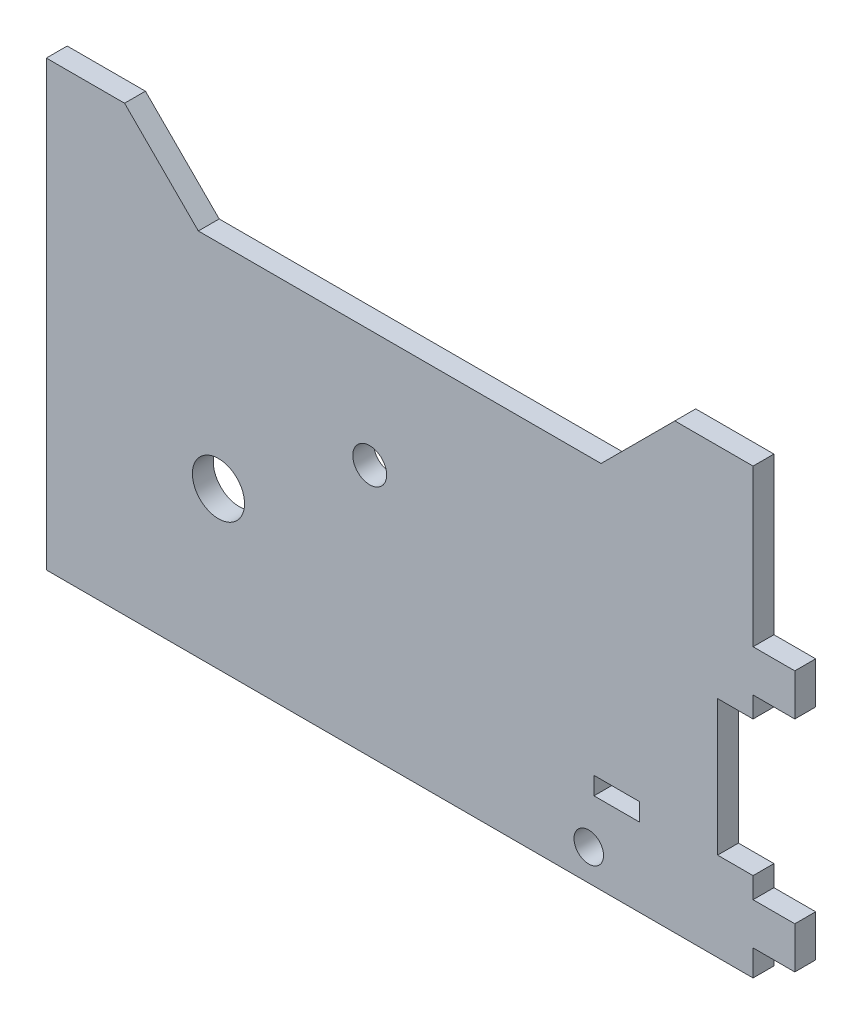
ISO-10303-21;
HEADER;
FILE_DESCRIPTION(('STEP AP214'),'2;1');
FILE_NAME('part.step','',(''),(''),'','','');
FILE_SCHEMA(('AUTOMOTIVE_DESIGN { 1 0 10303 214 1 1 1 1 }'));
ENDSEC;
DATA;
#1=APPLICATION_CONTEXT('core data for automotive mechanical design processes');
#2=APPLICATION_PROTOCOL_DEFINITION('international standard','automotive_design',2000,#1);
#3=PRODUCT_CONTEXT('',#1,'mechanical');
#4=PRODUCT('Part','Part','',(#3));
#5=PRODUCT_RELATED_PRODUCT_CATEGORY('part','',(#4));
#6=PRODUCT_DEFINITION_FORMATION('','',#4);
#7=PRODUCT_DEFINITION_CONTEXT('part definition',#1,'design');
#8=PRODUCT_DEFINITION('design','',#6,#7);
#9=PRODUCT_DEFINITION_SHAPE('','',#8);
#10=(LENGTH_UNIT() NAMED_UNIT(*) SI_UNIT(.MILLI.,.METRE.));
#11=(NAMED_UNIT(*) PLANE_ANGLE_UNIT() SI_UNIT($,.RADIAN.));
#12=(NAMED_UNIT(*) SI_UNIT($,.STERADIAN.) SOLID_ANGLE_UNIT());
#13=UNCERTAINTY_MEASURE_WITH_UNIT(LENGTH_MEASURE(1.E-05),#10,'distance_accuracy_value','');
#14=(GEOMETRIC_REPRESENTATION_CONTEXT(3) GLOBAL_UNCERTAINTY_ASSIGNED_CONTEXT((#13)) GLOBAL_UNIT_ASSIGNED_CONTEXT((#10,
#11,#12)) REPRESENTATION_CONTEXT('',''));
#15=CARTESIAN_POINT('',(0.,0.,0.));
#16=DIRECTION('',(0.,0.,1.));
#17=DIRECTION('',(1.,0.,0.));
#18=AXIS2_PLACEMENT_3D('',#15,#16,#17);
#19=CARTESIAN_POINT('',(0.,0.,4.));
#20=DIRECTION('',(0.,0.,-1.));
#21=DIRECTION('',(-1.,0.,0.));
#22=AXIS2_PLACEMENT_3D('',#19,#20,#21);
#23=PLANE('',#22);
#24=CARTESIAN_POINT('',(-46.,0.,4.));
#25=DIRECTION('',(0.,0.,1.));
#26=DIRECTION('',(1.,0.,0.));
#27=AXIS2_PLACEMENT_3D('',#24,#25,#26);
#28=CIRCLE('',#27,5.);
#29=CARTESIAN_POINT('',(-41.,0.,4.));
#30=VERTEX_POINT('',#29);
#31=EDGE_CURVE('E287',#30,#30,#28,.T.);
#32=ORIENTED_EDGE('',*,*,#31,.F.);
#33=EDGE_LOOP('',(#32));
#34=FACE_BOUND('',#33,.T.);
#35=CARTESIAN_POINT('',(-17.,18.39610675,4.));
#36=DIRECTION('',(0.,0.,1.));
#37=DIRECTION('',(1.,0.,0.));
#38=AXIS2_PLACEMENT_3D('',#35,#36,#37);
#39=CIRCLE('',#38,3.25);
#40=CARTESIAN_POINT('',(-13.75,18.39610675,4.));
#41=VERTEX_POINT('',#40);
#42=EDGE_CURVE('E293',#41,#41,#39,.T.);
#43=ORIENTED_EDGE('',*,*,#42,.F.);
#44=EDGE_LOOP('',(#43));
#45=FACE_BOUND('',#44,.T.);
#46=DIRECTION('',(0.,1.,0.));
#47=VECTOR('',#46,1.);
#48=CARTESIAN_POINT('',(56.5,30.,4.));
#49=LINE('',#48,#47);
#50=CARTESIAN_POINT('',(56.5,25.,4.));
#51=VERTEX_POINT('',#50);
#52=CARTESIAN_POINT('',(56.5,55.,4.));
#53=VERTEX_POINT('',#52);
#54=EDGE_CURVE('E195',#51,#53,#49,.T.);
#55=ORIENTED_EDGE('',*,*,#54,.T.);
#56=DIRECTION('',(-1.,0.,0.));
#57=VECTOR('',#56,1.);
#58=CARTESIAN_POINT('',(56.5,55.,4.));
#59=LINE('',#58,#57);
#60=CARTESIAN_POINT('',(41.5,55.,4.));
#61=VERTEX_POINT('',#60);
#62=EDGE_CURVE('E199',#53,#61,#59,.T.);
#63=ORIENTED_EDGE('',*,*,#62,.T.);
#64=DIRECTION('',(-0.707106781186548,-0.707106781186547,0.));
#65=VECTOR('',#64,1.);
#66=CARTESIAN_POINT('',(41.5,55.,4.));
#67=LINE('',#66,#65);
#68=CARTESIAN_POINT('',(27.357864376269,40.857864376269,4.));
#69=VERTEX_POINT('',#68);
#70=EDGE_CURVE('E221',#61,#69,#67,.T.);
#71=ORIENTED_EDGE('',*,*,#70,.T.);
#72=DIRECTION('',(-1.,0.,0.));
#73=VECTOR('',#72,1.);
#74=CARTESIAN_POINT('',(27.357864376269,40.857864376269,4.));
#75=LINE('',#74,#73);
#76=CARTESIAN_POINT('',(-49.8578643762691,40.857864376269,4.));
#77=VERTEX_POINT('',#76);
#78=EDGE_CURVE('E224',#69,#77,#75,.T.);
#79=ORIENTED_EDGE('',*,*,#78,.T.);
#80=DIRECTION('',(-0.707106781186546,0.707106781186549,0.));
#81=VECTOR('',#80,1.);
#82=CARTESIAN_POINT('',(-49.8578643762691,40.857864376269,4.));
#83=LINE('',#82,#81);
#84=CARTESIAN_POINT('',(-64.,55.,4.));
#85=VERTEX_POINT('',#84);
#86=EDGE_CURVE('E231',#77,#85,#83,.T.);
#87=ORIENTED_EDGE('',*,*,#86,.T.);
#88=DIRECTION('',(-1.,0.,0.));
#89=VECTOR('',#88,1.);
#90=CARTESIAN_POINT('',(-64.,55.,4.));
#91=LINE('',#90,#89);
#92=CARTESIAN_POINT('',(-79.,55.,4.));
#93=VERTEX_POINT('',#92);
#94=EDGE_CURVE('E233',#85,#93,#91,.T.);
#95=ORIENTED_EDGE('',*,*,#94,.T.);
#96=DIRECTION('',(0.,-1.,0.));
#97=VECTOR('',#96,1.);
#98=CARTESIAN_POINT('',(-79.,-30.,4.));
#99=LINE('',#98,#97);
#100=CARTESIAN_POINT('',(-79.,-30.,4.));
#101=VERTEX_POINT('',#100);
#102=EDGE_CURVE('E299',#93,#101,#99,.T.);
#103=ORIENTED_EDGE('',*,*,#102,.T.);
#104=DIRECTION('',(1.,0.,0.));
#105=VECTOR('',#104,1.);
#106=CARTESIAN_POINT('',(-79.,-30.,4.));
#107=LINE('',#106,#105);
#108=CARTESIAN_POINT('',(56.5,-30.,4.));
#109=VERTEX_POINT('',#108);
#110=EDGE_CURVE('E301',#101,#109,#107,.T.);
#111=ORIENTED_EDGE('',*,*,#110,.T.);
#112=DIRECTION('',(0.,1.,0.));
#113=VECTOR('',#112,1.);
#114=CARTESIAN_POINT('',(56.5,-25.,4.));
#115=LINE('',#114,#113);
#116=CARTESIAN_POINT('',(56.5,-25.,4.));
#117=VERTEX_POINT('',#116);
#118=EDGE_CURVE('E303',#109,#117,#115,.T.);
#119=ORIENTED_EDGE('',*,*,#118,.T.);
#120=DIRECTION('',(1.,0.,0.));
#121=VECTOR('',#120,1.);
#122=CARTESIAN_POINT('',(64.5,-25.,4.));
#123=LINE('',#122,#121);
#124=CARTESIAN_POINT('',(64.5,-25.,4.));
#125=VERTEX_POINT('',#124);
#126=EDGE_CURVE('E305',#117,#125,#123,.T.);
#127=ORIENTED_EDGE('',*,*,#126,.T.);
#128=DIRECTION('',(0.,1.,0.));
#129=VECTOR('',#128,1.);
#130=CARTESIAN_POINT('',(64.5,-17.,4.));
#131=LINE('',#130,#129);
#132=CARTESIAN_POINT('',(64.5,-17.,4.));
#133=VERTEX_POINT('',#132);
#134=EDGE_CURVE('E307',#125,#133,#131,.T.);
#135=ORIENTED_EDGE('',*,*,#134,.T.);
#136=DIRECTION('',(-1.,0.,0.));
#137=VECTOR('',#136,1.);
#138=CARTESIAN_POINT('',(56.5,-17.,4.));
#139=LINE('',#138,#137);
#140=CARTESIAN_POINT('',(56.5,-17.,4.));
#141=VERTEX_POINT('',#140);
#142=EDGE_CURVE('E309',#133,#141,#139,.T.);
#143=ORIENTED_EDGE('',*,*,#142,.T.);
#144=DIRECTION('',(0.,1.,0.));
#145=VECTOR('',#144,1.);
#146=CARTESIAN_POINT('',(56.5,-13.,4.));
#147=LINE('',#146,#145);
#148=CARTESIAN_POINT('',(56.5,-13.,4.));
#149=VERTEX_POINT('',#148);
#150=EDGE_CURVE('E311',#141,#149,#147,.T.);
#151=ORIENTED_EDGE('',*,*,#150,.T.);
#152=DIRECTION('',(-1.,0.,0.));
#153=VECTOR('',#152,1.);
#154=CARTESIAN_POINT('',(49.7,-13.,4.));
#155=LINE('',#154,#153);
#156=CARTESIAN_POINT('',(49.7,-13.,4.));
#157=VERTEX_POINT('',#156);
#158=EDGE_CURVE('E313',#149,#157,#155,.T.);
#159=ORIENTED_EDGE('',*,*,#158,.T.);
#160=DIRECTION('',(0.,1.,0.));
#161=VECTOR('',#160,1.);
#162=CARTESIAN_POINT('',(49.7,13.,4.));
#163=LINE('',#162,#161);
#164=CARTESIAN_POINT('',(49.7,13.,4.));
#165=VERTEX_POINT('',#164);
#166=EDGE_CURVE('E315',#157,#165,#163,.T.);
#167=ORIENTED_EDGE('',*,*,#166,.T.);
#168=DIRECTION('',(1.,0.,0.));
#169=VECTOR('',#168,1.);
#170=CARTESIAN_POINT('',(56.5,13.,4.));
#171=LINE('',#170,#169);
#172=CARTESIAN_POINT('',(56.5,13.,4.));
#173=VERTEX_POINT('',#172);
#174=EDGE_CURVE('E317',#165,#173,#171,.T.);
#175=ORIENTED_EDGE('',*,*,#174,.T.);
#176=DIRECTION('',(0.,1.,0.));
#177=VECTOR('',#176,1.);
#178=CARTESIAN_POINT('',(56.5,17.,4.));
#179=LINE('',#178,#177);
#180=CARTESIAN_POINT('',(56.5,17.,4.));
#181=VERTEX_POINT('',#180);
#182=EDGE_CURVE('E319',#173,#181,#179,.T.);
#183=ORIENTED_EDGE('',*,*,#182,.T.);
#184=DIRECTION('',(1.,0.,0.));
#185=VECTOR('',#184,1.);
#186=CARTESIAN_POINT('',(64.5,17.,4.));
#187=LINE('',#186,#185);
#188=CARTESIAN_POINT('',(64.5,17.,4.));
#189=VERTEX_POINT('',#188);
#190=EDGE_CURVE('E321',#181,#189,#187,.T.);
#191=ORIENTED_EDGE('',*,*,#190,.T.);
#192=DIRECTION('',(0.,1.,0.));
#193=VECTOR('',#192,1.);
#194=CARTESIAN_POINT('',(64.5,25.,4.));
#195=LINE('',#194,#193);
#196=CARTESIAN_POINT('',(64.5,25.,4.));
#197=VERTEX_POINT('',#196);
#198=EDGE_CURVE('E323',#189,#197,#195,.T.);
#199=ORIENTED_EDGE('',*,*,#198,.T.);
#200=DIRECTION('',(-1.,0.,0.));
#201=VECTOR('',#200,1.);
#202=CARTESIAN_POINT('',(56.5,25.,4.));
#203=LINE('',#202,#201);
#204=EDGE_CURVE('E202',#197,#51,#203,.T.);
#205=ORIENTED_EDGE('',*,*,#204,.T.);
#206=EDGE_LOOP('',(#55,#63,#71,#79,#87,#95,#103,#111,#119,#127,#135,#143,#151,#159,#167,#175,
#183,#191,#199,#205));
#207=FACE_BOUND('',#206,.T.);
#208=DIRECTION('',(0.,-1.,0.));
#209=VECTOR('',#208,1.);
#210=CARTESIAN_POINT('',(26.,-11.6,4.));
#211=LINE('',#210,#209);
#212=CARTESIAN_POINT('',(26.,-11.6,4.));
#213=VERTEX_POINT('',#212);
#214=CARTESIAN_POINT('',(26.,-15.,4.));
#215=VERTEX_POINT('',#214);
#216=EDGE_CURVE('E261',#213,#215,#211,.T.);
#217=ORIENTED_EDGE('',*,*,#216,.F.);
#218=DIRECTION('',(-1.,0.,0.));
#219=VECTOR('',#218,1.);
#220=CARTESIAN_POINT('',(26.,-11.6,4.));
#221=LINE('',#220,#219);
#222=CARTESIAN_POINT('',(34.7,-11.6,4.));
#223=VERTEX_POINT('',#222);
#224=EDGE_CURVE('E268',#223,#213,#221,.T.);
#225=ORIENTED_EDGE('',*,*,#224,.F.);
#226=DIRECTION('',(0.,1.,0.));
#227=VECTOR('',#226,1.);
#228=CARTESIAN_POINT('',(34.7,-11.6,4.));
#229=LINE('',#228,#227);
#230=CARTESIAN_POINT('',(34.7,-15.,4.));
#231=VERTEX_POINT('',#230);
#232=EDGE_CURVE('E266',#231,#223,#229,.T.);
#233=ORIENTED_EDGE('',*,*,#232,.F.);
#234=DIRECTION('',(1.,0.,0.));
#235=VECTOR('',#234,1.);
#236=CARTESIAN_POINT('',(26.,-15.,4.));
#237=LINE('',#236,#235);
#238=EDGE_CURVE('E263',#215,#231,#237,.T.);
#239=ORIENTED_EDGE('',*,*,#238,.F.);
#240=EDGE_LOOP('',(#217,#225,#233,#239));
#241=FACE_BOUND('',#240,.T.);
#242=CARTESIAN_POINT('',(25.,-24.,4.));
#243=DIRECTION('',(0.,0.,1.));
#244=DIRECTION('',(1.,0.,0.));
#245=AXIS2_PLACEMENT_3D('',#242,#243,#244);
#246=CIRCLE('',#245,2.83);
#247=CARTESIAN_POINT('',(27.83,-24.,4.));
#248=VERTEX_POINT('',#247);
#249=EDGE_CURVE('E256',#248,#248,#246,.T.);
#250=ORIENTED_EDGE('',*,*,#249,.F.);
#251=EDGE_LOOP('',(#250));
#252=FACE_BOUND('',#251,.T.);
#253=ADVANCED_FACE('F33',(#34,#45,#207,#241,#252),#23,.F.);
#254=CARTESIAN_POINT('',(0.,0.,0.));
#255=DIRECTION('',(0.,0.,-1.));
#256=DIRECTION('',(-1.,0.,0.));
#257=AXIS2_PLACEMENT_3D('',#254,#255,#256);
#258=PLANE('',#257);
#259=DIRECTION('',(-1.,0.,0.));
#260=VECTOR('',#259,1.);
#261=CARTESIAN_POINT('',(26.,-11.6,0.));
#262=LINE('',#261,#260);
#263=CARTESIAN_POINT('',(34.7,-11.6,0.));
#264=VERTEX_POINT('',#263);
#265=CARTESIAN_POINT('',(26.,-11.6,0.));
#266=VERTEX_POINT('',#265);
#267=EDGE_CURVE('E264',#264,#266,#262,.T.);
#268=ORIENTED_EDGE('',*,*,#267,.T.);
#269=DIRECTION('',(0.,-1.,0.));
#270=VECTOR('',#269,1.);
#271=CARTESIAN_POINT('',(26.,-11.6,0.));
#272=LINE('',#271,#270);
#273=CARTESIAN_POINT('',(26.,-15.,0.));
#274=VERTEX_POINT('',#273);
#275=EDGE_CURVE('E56',#266,#274,#272,.T.);
#276=ORIENTED_EDGE('',*,*,#275,.T.);
#277=DIRECTION('',(1.,0.,0.));
#278=VECTOR('',#277,1.);
#279=CARTESIAN_POINT('',(26.,-15.,0.));
#280=LINE('',#279,#278);
#281=CARTESIAN_POINT('',(34.7,-15.,0.));
#282=VERTEX_POINT('',#281);
#283=EDGE_CURVE('E272',#274,#282,#280,.T.);
#284=ORIENTED_EDGE('',*,*,#283,.T.);
#285=DIRECTION('',(0.,1.,0.));
#286=VECTOR('',#285,1.);
#287=CARTESIAN_POINT('',(34.7,-11.6,0.));
#288=LINE('',#287,#286);
#289=EDGE_CURVE('E275',#282,#264,#288,.T.);
#290=ORIENTED_EDGE('',*,*,#289,.T.);
#291=EDGE_LOOP('',(#268,#276,#284,#290));
#292=FACE_BOUND('',#291,.T.);
#293=CARTESIAN_POINT('',(-46.,0.,0.));
#294=DIRECTION('',(0.,0.,1.));
#295=DIRECTION('',(1.,0.,0.));
#296=AXIS2_PLACEMENT_3D('',#293,#294,#295);
#297=CIRCLE('',#296,5.);
#298=CARTESIAN_POINT('',(-41.,0.,0.));
#299=VERTEX_POINT('',#298);
#300=EDGE_CURVE('E286',#299,#299,#297,.T.);
#301=ORIENTED_EDGE('',*,*,#300,.T.);
#302=EDGE_LOOP('',(#301));
#303=FACE_BOUND('',#302,.T.);
#304=DIRECTION('',(0.,-1.,0.));
#305=VECTOR('',#304,1.);
#306=CARTESIAN_POINT('',(-79.,-30.,0.));
#307=LINE('',#306,#305);
#308=CARTESIAN_POINT('',(-79.,55.,0.));
#309=VERTEX_POINT('',#308);
#310=CARTESIAN_POINT('',(-79.,-30.,0.));
#311=VERTEX_POINT('',#310);
#312=EDGE_CURVE('E296',#309,#311,#307,.T.);
#313=ORIENTED_EDGE('',*,*,#312,.F.);
#314=DIRECTION('',(-1.,0.,0.));
#315=VECTOR('',#314,1.);
#316=CARTESIAN_POINT('',(-64.,55.,0.));
#317=LINE('',#316,#315);
#318=CARTESIAN_POINT('',(-64.,55.,0.));
#319=VERTEX_POINT('',#318);
#320=EDGE_CURVE('E222',#319,#309,#317,.T.);
#321=ORIENTED_EDGE('',*,*,#320,.F.);
#322=DIRECTION('',(-0.707106781186546,0.707106781186549,0.));
#323=VECTOR('',#322,1.);
#324=CARTESIAN_POINT('',(-49.8578643762691,40.857864376269,0.));
#325=LINE('',#324,#323);
#326=CARTESIAN_POINT('',(-49.8578643762691,40.857864376269,0.));
#327=VERTEX_POINT('',#326);
#328=EDGE_CURVE('E227',#327,#319,#325,.T.);
#329=ORIENTED_EDGE('',*,*,#328,.F.);
#330=DIRECTION('',(-1.,0.,0.));
#331=VECTOR('',#330,1.);
#332=CARTESIAN_POINT('',(27.357864376269,40.857864376269,0.));
#333=LINE('',#332,#331);
#334=CARTESIAN_POINT('',(27.357864376269,40.857864376269,0.));
#335=VERTEX_POINT('',#334);
#336=EDGE_CURVE('E241',#335,#327,#333,.T.);
#337=ORIENTED_EDGE('',*,*,#336,.F.);
#338=DIRECTION('',(-0.707106781186548,-0.707106781186547,0.));
#339=VECTOR('',#338,1.);
#340=CARTESIAN_POINT('',(41.5,55.,0.));
#341=LINE('',#340,#339);
#342=CARTESIAN_POINT('',(41.5,55.,0.));
#343=VERTEX_POINT('',#342);
#344=EDGE_CURVE('E239',#343,#335,#341,.T.);
#345=ORIENTED_EDGE('',*,*,#344,.F.);
#346=DIRECTION('',(-1.,0.,0.));
#347=VECTOR('',#346,1.);
#348=CARTESIAN_POINT('',(56.5,55.,0.));
#349=LINE('',#348,#347);
#350=CARTESIAN_POINT('',(56.5,55.,0.));
#351=VERTEX_POINT('',#350);
#352=EDGE_CURVE('E237',#351,#343,#349,.T.);
#353=ORIENTED_EDGE('',*,*,#352,.F.);
#354=DIRECTION('',(0.,1.,0.));
#355=VECTOR('',#354,1.);
#356=CARTESIAN_POINT('',(56.5,30.,0.));
#357=LINE('',#356,#355);
#358=CARTESIAN_POINT('',(56.5,25.,0.));
#359=VERTEX_POINT('',#358);
#360=EDGE_CURVE('E212',#359,#351,#357,.T.);
#361=ORIENTED_EDGE('',*,*,#360,.F.);
#362=DIRECTION('',(-1.,0.,0.));
#363=VECTOR('',#362,1.);
#364=CARTESIAN_POINT('',(56.5,25.,0.));
#365=LINE('',#364,#363);
#366=CARTESIAN_POINT('',(64.5,25.,0.));
#367=VERTEX_POINT('',#366);
#368=EDGE_CURVE('E352',#367,#359,#365,.T.);
#369=ORIENTED_EDGE('',*,*,#368,.F.);
#370=DIRECTION('',(0.,1.,0.));
#371=VECTOR('',#370,1.);
#372=CARTESIAN_POINT('',(64.5,25.,0.));
#373=LINE('',#372,#371);
#374=CARTESIAN_POINT('',(64.5,17.,0.));
#375=VERTEX_POINT('',#374);
#376=EDGE_CURVE('E350',#375,#367,#373,.T.);
#377=ORIENTED_EDGE('',*,*,#376,.F.);
#378=DIRECTION('',(1.,0.,0.));
#379=VECTOR('',#378,1.);
#380=CARTESIAN_POINT('',(64.5,17.,0.));
#381=LINE('',#380,#379);
#382=CARTESIAN_POINT('',(56.5,17.,0.));
#383=VERTEX_POINT('',#382);
#384=EDGE_CURVE('E348',#383,#375,#381,.T.);
#385=ORIENTED_EDGE('',*,*,#384,.F.);
#386=DIRECTION('',(0.,1.,0.));
#387=VECTOR('',#386,1.);
#388=CARTESIAN_POINT('',(56.5,17.,0.));
#389=LINE('',#388,#387);
#390=CARTESIAN_POINT('',(56.5,13.,0.));
#391=VERTEX_POINT('',#390);
#392=EDGE_CURVE('E346',#391,#383,#389,.T.);
#393=ORIENTED_EDGE('',*,*,#392,.F.);
#394=DIRECTION('',(1.,0.,0.));
#395=VECTOR('',#394,1.);
#396=CARTESIAN_POINT('',(56.5,13.,0.));
#397=LINE('',#396,#395);
#398=CARTESIAN_POINT('',(49.7,13.,0.));
#399=VERTEX_POINT('',#398);
#400=EDGE_CURVE('E344',#399,#391,#397,.T.);
#401=ORIENTED_EDGE('',*,*,#400,.F.);
#402=DIRECTION('',(0.,1.,0.));
#403=VECTOR('',#402,1.);
#404=CARTESIAN_POINT('',(49.7,13.,0.));
#405=LINE('',#404,#403);
#406=CARTESIAN_POINT('',(49.7,-13.,0.));
#407=VERTEX_POINT('',#406);
#408=EDGE_CURVE('E342',#407,#399,#405,.T.);
#409=ORIENTED_EDGE('',*,*,#408,.F.);
#410=DIRECTION('',(-1.,0.,0.));
#411=VECTOR('',#410,1.);
#412=CARTESIAN_POINT('',(49.7,-13.,0.));
#413=LINE('',#412,#411);
#414=CARTESIAN_POINT('',(56.5,-13.,0.));
#415=VERTEX_POINT('',#414);
#416=EDGE_CURVE('E340',#415,#407,#413,.T.);
#417=ORIENTED_EDGE('',*,*,#416,.F.);
#418=DIRECTION('',(0.,1.,0.));
#419=VECTOR('',#418,1.);
#420=CARTESIAN_POINT('',(56.5,-13.,0.));
#421=LINE('',#420,#419);
#422=CARTESIAN_POINT('',(56.5,-17.,0.));
#423=VERTEX_POINT('',#422);
#424=EDGE_CURVE('E338',#423,#415,#421,.T.);
#425=ORIENTED_EDGE('',*,*,#424,.F.);
#426=DIRECTION('',(-1.,0.,0.));
#427=VECTOR('',#426,1.);
#428=CARTESIAN_POINT('',(56.5,-17.,0.));
#429=LINE('',#428,#427);
#430=CARTESIAN_POINT('',(64.5,-17.,0.));
#431=VERTEX_POINT('',#430);
#432=EDGE_CURVE('E336',#431,#423,#429,.T.);
#433=ORIENTED_EDGE('',*,*,#432,.F.);
#434=DIRECTION('',(0.,1.,0.));
#435=VECTOR('',#434,1.);
#436=CARTESIAN_POINT('',(64.5,-17.,0.));
#437=LINE('',#436,#435);
#438=CARTESIAN_POINT('',(64.5,-25.,0.));
#439=VERTEX_POINT('',#438);
#440=EDGE_CURVE('E334',#439,#431,#437,.T.);
#441=ORIENTED_EDGE('',*,*,#440,.F.);
#442=DIRECTION('',(1.,0.,0.));
#443=VECTOR('',#442,1.);
#444=CARTESIAN_POINT('',(64.5,-25.,0.));
#445=LINE('',#444,#443);
#446=CARTESIAN_POINT('',(56.5,-25.,0.));
#447=VERTEX_POINT('',#446);
#448=EDGE_CURVE('E332',#447,#439,#445,.T.);
#449=ORIENTED_EDGE('',*,*,#448,.F.);
#450=DIRECTION('',(0.,1.,0.));
#451=VECTOR('',#450,1.);
#452=CARTESIAN_POINT('',(56.5,-25.,0.));
#453=LINE('',#452,#451);
#454=CARTESIAN_POINT('',(56.5,-30.,0.));
#455=VERTEX_POINT('',#454);
#456=EDGE_CURVE('E330',#455,#447,#453,.T.);
#457=ORIENTED_EDGE('',*,*,#456,.F.);
#458=DIRECTION('',(1.,0.,0.));
#459=VECTOR('',#458,1.);
#460=CARTESIAN_POINT('',(56.5,-30.,0.));
#461=LINE('',#460,#459);
#462=EDGE_CURVE('E328',#311,#455,#461,.T.);
#463=ORIENTED_EDGE('',*,*,#462,.F.);
#464=EDGE_LOOP('',(#313,#321,#329,#337,#345,#353,#361,#369,#377,#385,#393,#401,#409,#417,#425,
#433,#441,#449,#457,#463));
#465=FACE_BOUND('',#464,.T.);
#466=CARTESIAN_POINT('',(-17.,18.39610675,0.));
#467=DIRECTION('',(0.,0.,1.));
#468=DIRECTION('',(1.,0.,0.));
#469=AXIS2_PLACEMENT_3D('',#466,#467,#468);
#470=CIRCLE('',#469,3.25);
#471=CARTESIAN_POINT('',(-13.75,18.39610675,0.));
#472=VERTEX_POINT('',#471);
#473=EDGE_CURVE('E290',#472,#472,#470,.T.);
#474=ORIENTED_EDGE('',*,*,#473,.T.);
#475=EDGE_LOOP('',(#474));
#476=FACE_BOUND('',#475,.T.);
#477=CARTESIAN_POINT('',(25.,-24.,0.));
#478=DIRECTION('',(0.,0.,1.));
#479=DIRECTION('',(1.,0.,0.));
#480=AXIS2_PLACEMENT_3D('',#477,#478,#479);
#481=CIRCLE('',#480,2.83);
#482=CARTESIAN_POINT('',(27.83,-24.,0.));
#483=VERTEX_POINT('',#482);
#484=EDGE_CURVE('E215',#483,#483,#481,.T.);
#485=ORIENTED_EDGE('',*,*,#484,.T.);
#486=EDGE_LOOP('',(#485));
#487=FACE_BOUND('',#486,.T.);
#488=ADVANCED_FACE('F399',(#292,#303,#465,#476,#487),#258,.T.);
#489=CARTESIAN_POINT('',(-79.,-30.,4.));
#490=DIRECTION('',(1.,0.,0.));
#491=DIRECTION('',(0.,0.,-1.));
#492=AXIS2_PLACEMENT_3D('',#489,#490,#491);
#493=PLANE('',#492);
#494=ORIENTED_EDGE('',*,*,#312,.T.);
#495=DIRECTION('',(0.,0.,-1.));
#496=VECTOR('',#495,1.);
#497=CARTESIAN_POINT('',(-79.,-30.,4.));
#498=LINE('',#497,#496);
#499=EDGE_CURVE('E11',#101,#311,#498,.T.);
#500=ORIENTED_EDGE('',*,*,#499,.F.);
#501=ORIENTED_EDGE('',*,*,#102,.F.);
#502=DIRECTION('',(0.,0.,-1.));
#503=VECTOR('',#502,1.);
#504=CARTESIAN_POINT('',(-79.,55.,4.));
#505=LINE('',#504,#503);
#506=EDGE_CURVE('E236',#93,#309,#505,.T.);
#507=ORIENTED_EDGE('',*,*,#506,.T.);
#508=EDGE_LOOP('',(#494,#500,#501,#507));
#509=FACE_BOUND('',#508,.T.);
#510=ADVANCED_FACE('F35',(#509),#493,.F.);
#511=CARTESIAN_POINT('',(56.5,-30.,4.));
#512=DIRECTION('',(0.,1.,0.));
#513=DIRECTION('',(0.,0.,1.));
#514=AXIS2_PLACEMENT_3D('',#511,#512,#513);
#515=PLANE('',#514);
#516=ORIENTED_EDGE('',*,*,#462,.T.);
#517=DIRECTION('',(0.,0.,-1.));
#518=VECTOR('',#517,1.);
#519=CARTESIAN_POINT('',(56.5,-30.,4.));
#520=LINE('',#519,#518);
#521=EDGE_CURVE('E41',#109,#455,#520,.T.);
#522=ORIENTED_EDGE('',*,*,#521,.F.);
#523=ORIENTED_EDGE('',*,*,#110,.F.);
#524=ORIENTED_EDGE('',*,*,#499,.T.);
#525=EDGE_LOOP('',(#516,#522,#523,#524));
#526=FACE_BOUND('',#525,.T.);
#527=ADVANCED_FACE('F414',(#526),#515,.F.);
#528=CARTESIAN_POINT('',(56.5,-25.,4.));
#529=DIRECTION('',(-1.,0.,0.));
#530=DIRECTION('',(0.,-1.,0.));
#531=AXIS2_PLACEMENT_3D('',#528,#529,#530);
#532=PLANE('',#531);
#533=ORIENTED_EDGE('',*,*,#456,.T.);
#534=DIRECTION('',(0.,0.,-1.));
#535=VECTOR('',#534,1.);
#536=CARTESIAN_POINT('',(56.5,-25.,4.));
#537=LINE('',#536,#535);
#538=EDGE_CURVE('E386',#117,#447,#537,.T.);
#539=ORIENTED_EDGE('',*,*,#538,.F.);
#540=ORIENTED_EDGE('',*,*,#118,.F.);
#541=ORIENTED_EDGE('',*,*,#521,.T.);
#542=EDGE_LOOP('',(#533,#539,#540,#541));
#543=FACE_BOUND('',#542,.T.);
#544=ADVANCED_FACE('F393',(#543),#532,.F.);
#545=CARTESIAN_POINT('',(64.5,-25.,4.));
#546=DIRECTION('',(0.,1.,0.));
#547=DIRECTION('',(0.,0.,1.));
#548=AXIS2_PLACEMENT_3D('',#545,#546,#547);
#549=PLANE('',#548);
#550=ORIENTED_EDGE('',*,*,#448,.T.);
#551=DIRECTION('',(0.,0.,-1.));
#552=VECTOR('',#551,1.);
#553=CARTESIAN_POINT('',(64.5,-25.,4.));
#554=LINE('',#553,#552);
#555=EDGE_CURVE('E383',#125,#439,#554,.T.);
#556=ORIENTED_EDGE('',*,*,#555,.F.);
#557=ORIENTED_EDGE('',*,*,#126,.F.);
#558=ORIENTED_EDGE('',*,*,#538,.T.);
#559=EDGE_LOOP('',(#550,#556,#557,#558));
#560=FACE_BOUND('',#559,.T.);
#561=ADVANCED_FACE('F405',(#560),#549,.F.);
#562=CARTESIAN_POINT('',(64.5,-17.,4.));
#563=DIRECTION('',(-1.,0.,0.));
#564=DIRECTION('',(0.,0.,1.));
#565=AXIS2_PLACEMENT_3D('',#562,#563,#564);
#566=PLANE('',#565);
#567=ORIENTED_EDGE('',*,*,#440,.T.);
#568=DIRECTION('',(0.,0.,-1.));
#569=VECTOR('',#568,1.);
#570=CARTESIAN_POINT('',(64.5,-17.,4.));
#571=LINE('',#570,#569);
#572=EDGE_CURVE('E380',#133,#431,#571,.T.);
#573=ORIENTED_EDGE('',*,*,#572,.F.);
#574=ORIENTED_EDGE('',*,*,#134,.F.);
#575=ORIENTED_EDGE('',*,*,#555,.T.);
#576=EDGE_LOOP('',(#567,#573,#574,#575));
#577=FACE_BOUND('',#576,.T.);
#578=ADVANCED_FACE('F409',(#577),#566,.F.);
#579=CARTESIAN_POINT('',(56.5,-17.,4.));
#580=DIRECTION('',(0.,-1.,0.));
#581=DIRECTION('',(0.,0.,-1.));
#582=AXIS2_PLACEMENT_3D('',#579,#580,#581);
#583=PLANE('',#582);
#584=ORIENTED_EDGE('',*,*,#432,.T.);
#585=DIRECTION('',(0.,0.,-1.));
#586=VECTOR('',#585,1.);
#587=CARTESIAN_POINT('',(56.5,-17.,4.));
#588=LINE('',#587,#586);
#589=EDGE_CURVE('E377',#141,#423,#588,.T.);
#590=ORIENTED_EDGE('',*,*,#589,.F.);
#591=ORIENTED_EDGE('',*,*,#142,.F.);
#592=ORIENTED_EDGE('',*,*,#572,.T.);
#593=EDGE_LOOP('',(#584,#590,#591,#592));
#594=FACE_BOUND('',#593,.T.);
#595=ADVANCED_FACE('F491',(#594),#583,.F.);
#596=CARTESIAN_POINT('',(56.5,-13.,4.));
#597=DIRECTION('',(-1.,0.,0.));
#598=DIRECTION('',(0.,-1.,0.));
#599=AXIS2_PLACEMENT_3D('',#596,#597,#598);
#600=PLANE('',#599);
#601=ORIENTED_EDGE('',*,*,#424,.T.);
#602=DIRECTION('',(0.,0.,-1.));
#603=VECTOR('',#602,1.);
#604=CARTESIAN_POINT('',(56.5,-13.,4.));
#605=LINE('',#604,#603);
#606=EDGE_CURVE('E374',#149,#415,#605,.T.);
#607=ORIENTED_EDGE('',*,*,#606,.F.);
#608=ORIENTED_EDGE('',*,*,#150,.F.);
#609=ORIENTED_EDGE('',*,*,#589,.T.);
#610=EDGE_LOOP('',(#601,#607,#608,#609));
#611=FACE_BOUND('',#610,.T.);
#612=ADVANCED_FACE('F487',(#611),#600,.F.);
#613=CARTESIAN_POINT('',(49.7,-13.,4.));
#614=DIRECTION('',(0.,-1.,0.));
#615=DIRECTION('',(1.,0.,0.));
#616=AXIS2_PLACEMENT_3D('',#613,#614,#615);
#617=PLANE('',#616);
#618=ORIENTED_EDGE('',*,*,#416,.T.);
#619=DIRECTION('',(0.,0.,-1.));
#620=VECTOR('',#619,1.);
#621=CARTESIAN_POINT('',(49.7,-13.,4.));
#622=LINE('',#621,#620);
#623=EDGE_CURVE('E371',#157,#407,#622,.T.);
#624=ORIENTED_EDGE('',*,*,#623,.F.);
#625=ORIENTED_EDGE('',*,*,#158,.F.);
#626=ORIENTED_EDGE('',*,*,#606,.T.);
#627=EDGE_LOOP('',(#618,#624,#625,#626));
#628=FACE_BOUND('',#627,.T.);
#629=ADVANCED_FACE('F483',(#628),#617,.F.);
#630=CARTESIAN_POINT('',(49.7,13.,4.));
#631=DIRECTION('',(-1.,0.,0.));
#632=DIRECTION('',(0.,-1.,0.));
#633=AXIS2_PLACEMENT_3D('',#630,#631,#632);
#634=PLANE('',#633);
#635=ORIENTED_EDGE('',*,*,#408,.T.);
#636=DIRECTION('',(0.,0.,-1.));
#637=VECTOR('',#636,1.);
#638=CARTESIAN_POINT('',(49.7,13.,4.));
#639=LINE('',#638,#637);
#640=EDGE_CURVE('E368',#165,#399,#639,.T.);
#641=ORIENTED_EDGE('',*,*,#640,.F.);
#642=ORIENTED_EDGE('',*,*,#166,.F.);
#643=ORIENTED_EDGE('',*,*,#623,.T.);
#644=EDGE_LOOP('',(#635,#641,#642,#643));
#645=FACE_BOUND('',#644,.T.);
#646=ADVANCED_FACE('F479',(#645),#634,.F.);
#647=CARTESIAN_POINT('',(56.5,13.,4.));
#648=DIRECTION('',(0.,1.,0.));
#649=DIRECTION('',(-1.,0.,0.));
#650=AXIS2_PLACEMENT_3D('',#647,#648,#649);
#651=PLANE('',#650);
#652=ORIENTED_EDGE('',*,*,#400,.T.);
#653=DIRECTION('',(0.,0.,-1.));
#654=VECTOR('',#653,1.);
#655=CARTESIAN_POINT('',(56.5,13.,4.));
#656=LINE('',#655,#654);
#657=EDGE_CURVE('E365',#173,#391,#656,.T.);
#658=ORIENTED_EDGE('',*,*,#657,.F.);
#659=ORIENTED_EDGE('',*,*,#174,.F.);
#660=ORIENTED_EDGE('',*,*,#640,.T.);
#661=EDGE_LOOP('',(#652,#658,#659,#660));
#662=FACE_BOUND('',#661,.T.);
#663=ADVANCED_FACE('F475',(#662),#651,.F.);
#664=CARTESIAN_POINT('',(56.5,17.,4.));
#665=DIRECTION('',(-1.,0.,0.));
#666=DIRECTION('',(0.,0.,1.));
#667=AXIS2_PLACEMENT_3D('',#664,#665,#666);
#668=PLANE('',#667);
#669=ORIENTED_EDGE('',*,*,#392,.T.);
#670=DIRECTION('',(0.,0.,-1.));
#671=VECTOR('',#670,1.);
#672=CARTESIAN_POINT('',(56.5,17.,4.));
#673=LINE('',#672,#671);
#674=EDGE_CURVE('E362',#181,#383,#673,.T.);
#675=ORIENTED_EDGE('',*,*,#674,.F.);
#676=ORIENTED_EDGE('',*,*,#182,.F.);
#677=ORIENTED_EDGE('',*,*,#657,.T.);
#678=EDGE_LOOP('',(#669,#675,#676,#677));
#679=FACE_BOUND('',#678,.T.);
#680=ADVANCED_FACE('F471',(#679),#668,.F.);
#681=CARTESIAN_POINT('',(64.5,17.,4.));
#682=DIRECTION('',(0.,1.,0.));
#683=DIRECTION('',(0.,0.,1.));
#684=AXIS2_PLACEMENT_3D('',#681,#682,#683);
#685=PLANE('',#684);
#686=ORIENTED_EDGE('',*,*,#384,.T.);
#687=DIRECTION('',(0.,0.,-1.));
#688=VECTOR('',#687,1.);
#689=CARTESIAN_POINT('',(64.5,17.,4.));
#690=LINE('',#689,#688);
#691=EDGE_CURVE('E359',#189,#375,#690,.T.);
#692=ORIENTED_EDGE('',*,*,#691,.F.);
#693=ORIENTED_EDGE('',*,*,#190,.F.);
#694=ORIENTED_EDGE('',*,*,#674,.T.);
#695=EDGE_LOOP('',(#686,#692,#693,#694));
#696=FACE_BOUND('',#695,.T.);
#697=ADVANCED_FACE('F467',(#696),#685,.F.);
#698=CARTESIAN_POINT('',(64.5,25.,4.));
#699=DIRECTION('',(-1.,0.,0.));
#700=DIRECTION('',(0.,0.,1.));
#701=AXIS2_PLACEMENT_3D('',#698,#699,#700);
#702=PLANE('',#701);
#703=ORIENTED_EDGE('',*,*,#376,.T.);
#704=DIRECTION('',(0.,0.,-1.));
#705=VECTOR('',#704,1.);
#706=CARTESIAN_POINT('',(64.5,25.,4.));
#707=LINE('',#706,#705);
#708=EDGE_CURVE('E356',#197,#367,#707,.T.);
#709=ORIENTED_EDGE('',*,*,#708,.F.);
#710=ORIENTED_EDGE('',*,*,#198,.F.);
#711=ORIENTED_EDGE('',*,*,#691,.T.);
#712=EDGE_LOOP('',(#703,#709,#710,#711));
#713=FACE_BOUND('',#712,.T.);
#714=ADVANCED_FACE('F463',(#713),#702,.F.);
#715=CARTESIAN_POINT('',(56.5,25.,4.));
#716=DIRECTION('',(0.,-1.,0.));
#717=DIRECTION('',(0.,0.,-1.));
#718=AXIS2_PLACEMENT_3D('',#715,#716,#717);
#719=PLANE('',#718);
#720=ORIENTED_EDGE('',*,*,#368,.T.);
#721=DIRECTION('',(0.,0.,-1.));
#722=VECTOR('',#721,1.);
#723=CARTESIAN_POINT('',(56.5,25.,4.));
#724=LINE('',#723,#722);
#725=EDGE_CURVE('E206',#51,#359,#724,.T.);
#726=ORIENTED_EDGE('',*,*,#725,.F.);
#727=ORIENTED_EDGE('',*,*,#204,.F.);
#728=ORIENTED_EDGE('',*,*,#708,.T.);
#729=EDGE_LOOP('',(#720,#726,#727,#728));
#730=FACE_BOUND('',#729,.T.);
#731=ADVANCED_FACE('F460',(#730),#719,.F.);
#732=CARTESIAN_POINT('',(56.5,30.,4.));
#733=DIRECTION('',(-1.,0.,0.));
#734=DIRECTION('',(0.,0.,1.));
#735=AXIS2_PLACEMENT_3D('',#732,#733,#734);
#736=PLANE('',#735);
#737=ORIENTED_EDGE('',*,*,#360,.T.);
#738=DIRECTION('',(0.,0.,-1.));
#739=VECTOR('',#738,1.);
#740=CARTESIAN_POINT('',(56.5,55.,4.));
#741=LINE('',#740,#739);
#742=EDGE_CURVE('E209',#53,#351,#741,.T.);
#743=ORIENTED_EDGE('',*,*,#742,.F.);
#744=ORIENTED_EDGE('',*,*,#54,.F.);
#745=ORIENTED_EDGE('',*,*,#725,.T.);
#746=EDGE_LOOP('',(#737,#743,#744,#745));
#747=FACE_BOUND('',#746,.T.);
#748=ADVANCED_FACE('F210',(#747),#736,.F.);
#749=CARTESIAN_POINT('',(-17.,18.39610675,4.));
#750=DIRECTION('',(0.,0.,-1.));
#751=DIRECTION('',(-1.,0.,0.));
#752=AXIS2_PLACEMENT_3D('',#749,#750,#751);
#753=CYLINDRICAL_SURFACE('',#752,3.25);
#754=ORIENTED_EDGE('',*,*,#42,.T.);
#755=EDGE_LOOP('',(#754));
#756=FACE_BOUND('',#755,.T.);
#757=ORIENTED_EDGE('',*,*,#473,.F.);
#758=EDGE_LOOP('',(#757));
#759=FACE_BOUND('',#758,.T.);
#760=ADVANCED_FACE('F455',(#756,#759),#753,.F.);
#761=CARTESIAN_POINT('',(-46.,0.,4.));
#762=DIRECTION('',(0.,0.,-1.));
#763=DIRECTION('',(-1.,0.,0.));
#764=AXIS2_PLACEMENT_3D('',#761,#762,#763);
#765=CYLINDRICAL_SURFACE('',#764,5.);
#766=ORIENTED_EDGE('',*,*,#31,.T.);
#767=EDGE_LOOP('',(#766));
#768=FACE_BOUND('',#767,.T.);
#769=ORIENTED_EDGE('',*,*,#300,.F.);
#770=EDGE_LOOP('',(#769));
#771=FACE_BOUND('',#770,.T.);
#772=ADVANCED_FACE('F566',(#768,#771),#765,.F.);
#773=CARTESIAN_POINT('',(26.,-11.6,4.));
#774=DIRECTION('',(1.,0.,0.));
#775=DIRECTION('',(0.,0.,-1.));
#776=AXIS2_PLACEMENT_3D('',#773,#774,#775);
#777=PLANE('',#776);
#778=ORIENTED_EDGE('',*,*,#275,.F.);
#779=DIRECTION('',(0.,0.,-1.));
#780=VECTOR('',#779,1.);
#781=CARTESIAN_POINT('',(26.,-11.6,4.));
#782=LINE('',#781,#780);
#783=EDGE_CURVE('E270',#213,#266,#782,.T.);
#784=ORIENTED_EDGE('',*,*,#783,.F.);
#785=ORIENTED_EDGE('',*,*,#216,.T.);
#786=DIRECTION('',(0.,0.,-1.));
#787=VECTOR('',#786,1.);
#788=CARTESIAN_POINT('',(26.,-15.,4.));
#789=LINE('',#788,#787);
#790=EDGE_CURVE('E284',#215,#274,#789,.T.);
#791=ORIENTED_EDGE('',*,*,#790,.T.);
#792=EDGE_LOOP('',(#778,#784,#785,#791));
#793=FACE_BOUND('',#792,.T.);
#794=ADVANCED_FACE('F556',(#793),#777,.T.);
#795=CARTESIAN_POINT('',(26.,-15.,4.));
#796=DIRECTION('',(0.,1.,0.));
#797=DIRECTION('',(0.,0.,1.));
#798=AXIS2_PLACEMENT_3D('',#795,#796,#797);
#799=PLANE('',#798);
#800=ORIENTED_EDGE('',*,*,#283,.F.);
#801=ORIENTED_EDGE('',*,*,#790,.F.);
#802=ORIENTED_EDGE('',*,*,#238,.T.);
#803=DIRECTION('',(0.,0.,-1.));
#804=VECTOR('',#803,1.);
#805=CARTESIAN_POINT('',(34.7,-15.,4.));
#806=LINE('',#805,#804);
#807=EDGE_CURVE('E282',#231,#282,#806,.T.);
#808=ORIENTED_EDGE('',*,*,#807,.T.);
#809=EDGE_LOOP('',(#800,#801,#802,#808));
#810=FACE_BOUND('',#809,.T.);
#811=ADVANCED_FACE('F546',(#810),#799,.T.);
#812=CARTESIAN_POINT('',(34.7,-11.6,4.));
#813=DIRECTION('',(-1.,0.,0.));
#814=DIRECTION('',(0.,0.,1.));
#815=AXIS2_PLACEMENT_3D('',#812,#813,#814);
#816=PLANE('',#815);
#817=ORIENTED_EDGE('',*,*,#289,.F.);
#818=ORIENTED_EDGE('',*,*,#807,.F.);
#819=ORIENTED_EDGE('',*,*,#232,.T.);
#820=DIRECTION('',(0.,0.,-1.));
#821=VECTOR('',#820,1.);
#822=CARTESIAN_POINT('',(34.7,-11.6,4.));
#823=LINE('',#822,#821);
#824=EDGE_CURVE('E48',#223,#264,#823,.T.);
#825=ORIENTED_EDGE('',*,*,#824,.T.);
#826=EDGE_LOOP('',(#817,#818,#819,#825));
#827=FACE_BOUND('',#826,.T.);
#828=ADVANCED_FACE('F537',(#827),#816,.T.);
#829=CARTESIAN_POINT('',(26.,-11.6,4.));
#830=DIRECTION('',(0.,-1.,0.));
#831=DIRECTION('',(1.,0.,0.));
#832=AXIS2_PLACEMENT_3D('',#829,#830,#831);
#833=PLANE('',#832);
#834=ORIENTED_EDGE('',*,*,#267,.F.);
#835=ORIENTED_EDGE('',*,*,#824,.F.);
#836=ORIENTED_EDGE('',*,*,#224,.T.);
#837=ORIENTED_EDGE('',*,*,#783,.T.);
#838=EDGE_LOOP('',(#834,#835,#836,#837));
#839=FACE_BOUND('',#838,.T.);
#840=ADVANCED_FACE('F527',(#839),#833,.T.);
#841=CARTESIAN_POINT('',(25.,-24.,4.));
#842=DIRECTION('',(0.,0.,-1.));
#843=DIRECTION('',(-1.,0.,0.));
#844=AXIS2_PLACEMENT_3D('',#841,#842,#843);
#845=CYLINDRICAL_SURFACE('',#844,2.83);
#846=ORIENTED_EDGE('',*,*,#249,.T.);
#847=EDGE_LOOP('',(#846));
#848=FACE_BOUND('',#847,.T.);
#849=ORIENTED_EDGE('',*,*,#484,.F.);
#850=EDGE_LOOP('',(#849));
#851=FACE_BOUND('',#850,.T.);
#852=ADVANCED_FACE('F442',(#848,#851),#845,.F.);
#853=CARTESIAN_POINT('',(56.5,55.,4.));
#854=DIRECTION('',(0.,-1.,0.));
#855=DIRECTION('',(0.,0.,-1.));
#856=AXIS2_PLACEMENT_3D('',#853,#854,#855);
#857=PLANE('',#856);
#858=ORIENTED_EDGE('',*,*,#352,.T.);
#859=DIRECTION('',(0.,0.,-1.));
#860=VECTOR('',#859,1.);
#861=CARTESIAN_POINT('',(41.5,55.,4.));
#862=LINE('',#861,#860);
#863=EDGE_CURVE('E216',#61,#343,#862,.T.);
#864=ORIENTED_EDGE('',*,*,#863,.F.);
#865=ORIENTED_EDGE('',*,*,#62,.F.);
#866=ORIENTED_EDGE('',*,*,#742,.T.);
#867=EDGE_LOOP('',(#858,#864,#865,#866));
#868=FACE_BOUND('',#867,.T.);
#869=ADVANCED_FACE('F218',(#868),#857,.F.);
#870=CARTESIAN_POINT('',(41.5,55.,4.));
#871=DIRECTION('',(0.707106781186547,-0.707106781186549,0.));
#872=DIRECTION('',(0.707106781186549,0.707106781186547,0.));
#873=AXIS2_PLACEMENT_3D('',#870,#871,#872);
#874=PLANE('',#873);
#875=ORIENTED_EDGE('',*,*,#344,.T.);
#876=DIRECTION('',(0.,0.,-1.));
#877=VECTOR('',#876,1.);
#878=CARTESIAN_POINT('',(27.357864376269,40.857864376269,4.));
#879=LINE('',#878,#877);
#880=EDGE_CURVE('E252',#69,#335,#879,.T.);
#881=ORIENTED_EDGE('',*,*,#880,.F.);
#882=ORIENTED_EDGE('',*,*,#70,.F.);
#883=ORIENTED_EDGE('',*,*,#863,.T.);
#884=EDGE_LOOP('',(#875,#881,#882,#883));
#885=FACE_BOUND('',#884,.T.);
#886=ADVANCED_FACE('F434',(#885),#874,.F.);
#887=CARTESIAN_POINT('',(27.357864376269,40.857864376269,4.));
#888=DIRECTION('',(0.,-1.,0.));
#889=DIRECTION('',(1.,0.,0.));
#890=AXIS2_PLACEMENT_3D('',#887,#888,#889);
#891=PLANE('',#890);
#892=ORIENTED_EDGE('',*,*,#336,.T.);
#893=DIRECTION('',(0.,0.,-1.));
#894=VECTOR('',#893,1.);
#895=CARTESIAN_POINT('',(-49.8578643762691,40.857864376269,4.));
#896=LINE('',#895,#894);
#897=EDGE_CURVE('E249',#77,#327,#896,.T.);
#898=ORIENTED_EDGE('',*,*,#897,.F.);
#899=ORIENTED_EDGE('',*,*,#78,.F.);
#900=ORIENTED_EDGE('',*,*,#880,.T.);
#901=EDGE_LOOP('',(#892,#898,#899,#900));
#902=FACE_BOUND('',#901,.T.);
#903=ADVANCED_FACE('F430',(#902),#891,.F.);
#904=CARTESIAN_POINT('',(-49.8578643762691,40.857864376269,4.));
#905=DIRECTION('',(-0.707106781186549,-0.707106781186546,0.));
#906=DIRECTION('',(0.707106781186546,-0.707106781186549,0.));
#907=AXIS2_PLACEMENT_3D('',#904,#905,#906);
#908=PLANE('',#907);
#909=ORIENTED_EDGE('',*,*,#328,.T.);
#910=DIRECTION('',(0.,0.,-1.));
#911=VECTOR('',#910,1.);
#912=CARTESIAN_POINT('',(-64.,55.,4.));
#913=LINE('',#912,#911);
#914=EDGE_CURVE('E246',#85,#319,#913,.T.);
#915=ORIENTED_EDGE('',*,*,#914,.F.);
#916=ORIENTED_EDGE('',*,*,#86,.F.);
#917=ORIENTED_EDGE('',*,*,#897,.T.);
#918=EDGE_LOOP('',(#909,#915,#916,#917));
#919=FACE_BOUND('',#918,.T.);
#920=ADVANCED_FACE('F425',(#919),#908,.F.);
#921=CARTESIAN_POINT('',(-64.,55.,4.));
#922=DIRECTION('',(0.,-1.,0.));
#923=DIRECTION('',(1.,0.,0.));
#924=AXIS2_PLACEMENT_3D('',#921,#922,#923);
#925=PLANE('',#924);
#926=ORIENTED_EDGE('',*,*,#320,.T.);
#927=ORIENTED_EDGE('',*,*,#506,.F.);
#928=ORIENTED_EDGE('',*,*,#94,.F.);
#929=ORIENTED_EDGE('',*,*,#914,.T.);
#930=EDGE_LOOP('',(#926,#927,#928,#929));
#931=FACE_BOUND('',#930,.T.);
#932=ADVANCED_FACE('F420',(#931),#925,.F.);
#933=CLOSED_SHELL('',(#253,#488,#510,#527,#544,#561,#578,#595,#612,#629,#646,#663,#680,#697,
#714,#731,#748,#760,#772,#794,#811,#828,#840,#852,#869,#886,#903,#920,#932));
#934=MANIFOLD_SOLID_BREP('B2',#933);
#935=ADVANCED_BREP_SHAPE_REPRESENTATION('',(#18,#934),#14);
#936=SHAPE_DEFINITION_REPRESENTATION(#9,#935);
ENDSEC;
END-ISO-10303-21;
